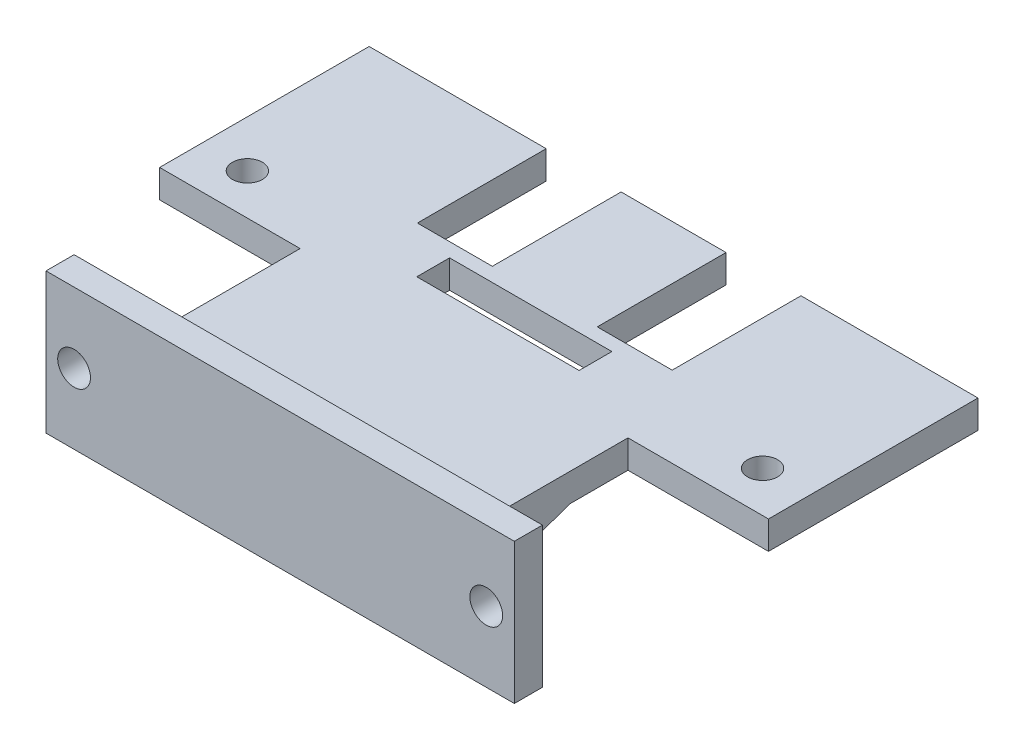
ISO-10303-21;
HEADER;
FILE_DESCRIPTION(('STEP AP214'),'2;1');
FILE_NAME('part.step','',(''),(''),'','','');
FILE_SCHEMA(('AUTOMOTIVE_DESIGN { 1 0 10303 214 1 1 1 1 }'));
ENDSEC;
DATA;
#1=APPLICATION_CONTEXT('core data for automotive mechanical design processes');
#2=APPLICATION_PROTOCOL_DEFINITION('international standard','automotive_design',2000,#1);
#3=PRODUCT_CONTEXT('',#1,'mechanical');
#4=PRODUCT('Part','Part','',(#3));
#5=PRODUCT_RELATED_PRODUCT_CATEGORY('part','',(#4));
#6=PRODUCT_DEFINITION_FORMATION('','',#4);
#7=PRODUCT_DEFINITION_CONTEXT('part definition',#1,'design');
#8=PRODUCT_DEFINITION('design','',#6,#7);
#9=PRODUCT_DEFINITION_SHAPE('','',#8);
#10=(LENGTH_UNIT() NAMED_UNIT(*) SI_UNIT(.MILLI.,.METRE.));
#11=(NAMED_UNIT(*) PLANE_ANGLE_UNIT() SI_UNIT($,.RADIAN.));
#12=(NAMED_UNIT(*) SI_UNIT($,.STERADIAN.) SOLID_ANGLE_UNIT());
#13=UNCERTAINTY_MEASURE_WITH_UNIT(LENGTH_MEASURE(1.E-05),#10,'distance_accuracy_value','');
#14=(GEOMETRIC_REPRESENTATION_CONTEXT(3) GLOBAL_UNCERTAINTY_ASSIGNED_CONTEXT((#13)) GLOBAL_UNIT_ASSIGNED_CONTEXT((#10,
#11,#12)) REPRESENTATION_CONTEXT('',''));
#15=CARTESIAN_POINT('',(0.,0.,0.));
#16=DIRECTION('',(0.,0.,1.));
#17=DIRECTION('',(1.,0.,0.));
#18=AXIS2_PLACEMENT_3D('',#15,#16,#17);
#19=CARTESIAN_POINT('',(-17.5,0.,-25.));
#20=DIRECTION('',(0.,1.,0.));
#21=DIRECTION('',(0.,0.,1.));
#22=AXIS2_PLACEMENT_3D('',#19,#20,#21);
#23=PLANE('',#22);
#24=CARTESIAN_POINT('',(27.5,0.,1.));
#25=DIRECTION('',(0.,1.,0.));
#26=DIRECTION('',(0.,0.,1.));
#27=AXIS2_PLACEMENT_3D('',#24,#25,#26);
#28=CIRCLE('',#27,1.59999999999999);
#29=CARTESIAN_POINT('',(27.5,0.,2.59999999999999));
#30=VERTEX_POINT('',#29);
#31=EDGE_CURVE('E292',#30,#30,#28,.T.);
#32=ORIENTED_EDGE('',*,*,#31,.T.);
#33=EDGE_LOOP('',(#32));
#34=FACE_BOUND('',#33,.T.);
#35=CARTESIAN_POINT('',(-27.5,0.,1.));
#36=DIRECTION('',(0.,1.,0.));
#37=DIRECTION('',(0.,0.,1.));
#38=AXIS2_PLACEMENT_3D('',#35,#36,#37);
#39=CIRCLE('',#38,1.59999999999999);
#40=CARTESIAN_POINT('',(-27.5,0.,2.59999999999999));
#41=VERTEX_POINT('',#40);
#42=EDGE_CURVE('E288',#41,#41,#39,.T.);
#43=ORIENTED_EDGE('',*,*,#42,.T.);
#44=EDGE_LOOP('',(#43));
#45=FACE_BOUND('',#44,.T.);
#46=DIRECTION('',(1.,0.,0.));
#47=VECTOR('',#46,1.);
#48=CARTESIAN_POINT('',(-17.5,0.,1.75));
#49=LINE('',#48,#47);
#50=CARTESIAN_POINT('',(-8.66365833731035,0.,1.75));
#51=VERTEX_POINT('',#50);
#52=CARTESIAN_POINT('',(8.66365833731035,0.,1.75));
#53=VERTEX_POINT('',#52);
#54=EDGE_CURVE('E42',#51,#53,#49,.T.);
#55=ORIENTED_EDGE('',*,*,#54,.T.);
#56=DIRECTION('',(0.,0.,-1.));
#57=VECTOR('',#56,1.);
#58=CARTESIAN_POINT('',(8.66365833731035,0.,-25.));
#59=LINE('',#58,#57);
#60=CARTESIAN_POINT('',(8.66365833731035,0.,-1.75));
#61=VERTEX_POINT('',#60);
#62=EDGE_CURVE('E11',#53,#61,#59,.T.);
#63=ORIENTED_EDGE('',*,*,#62,.T.);
#64=DIRECTION('',(-1.,0.,0.));
#65=VECTOR('',#64,1.);
#66=CARTESIAN_POINT('',(-17.5,0.,-1.75));
#67=LINE('',#66,#65);
#68=CARTESIAN_POINT('',(-8.66365833731035,0.,-1.75));
#69=VERTEX_POINT('',#68);
#70=EDGE_CURVE('E443',#61,#69,#67,.T.);
#71=ORIENTED_EDGE('',*,*,#70,.T.);
#72=DIRECTION('',(0.,0.,1.));
#73=VECTOR('',#72,1.);
#74=CARTESIAN_POINT('',(-8.66365833731035,0.,-25.));
#75=LINE('',#74,#73);
#76=EDGE_CURVE('E453',#69,#51,#75,.T.);
#77=ORIENTED_EDGE('',*,*,#76,.T.);
#78=EDGE_LOOP('',(#55,#63,#71,#77));
#79=FACE_BOUND('',#78,.T.);
#80=DIRECTION('',(-1.,0.,0.));
#81=VECTOR('',#80,1.);
#82=CARTESIAN_POINT('',(-12.5,0.,11.5401065880766));
#83=LINE('',#82,#81);
#84=CARTESIAN_POINT('',(-12.5,0.,11.5401065880766));
#85=VERTEX_POINT('',#84);
#86=CARTESIAN_POINT('',(-17.5,0.,11.5401065880766));
#87=VERTEX_POINT('',#86);
#88=EDGE_CURVE('E54',#85,#87,#83,.T.);
#89=ORIENTED_EDGE('',*,*,#88,.T.);
#90=DIRECTION('',(0.,0.,1.));
#91=VECTOR('',#90,1.);
#92=CARTESIAN_POINT('',(-17.5,0.,-25.));
#93=LINE('',#92,#91);
#94=CARTESIAN_POINT('',(-17.5,0.,5.36922738005254));
#95=VERTEX_POINT('',#94);
#96=EDGE_CURVE('E411',#95,#87,#93,.T.);
#97=ORIENTED_EDGE('',*,*,#96,.F.);
#98=DIRECTION('',(1.,0.,0.));
#99=VECTOR('',#98,1.);
#100=CARTESIAN_POINT('',(-32.5,0.,5.36922738005254));
#101=LINE('',#100,#99);
#102=CARTESIAN_POINT('',(-32.5,0.,5.36922738005254));
#103=VERTEX_POINT('',#102);
#104=EDGE_CURVE('E384',#103,#95,#101,.T.);
#105=ORIENTED_EDGE('',*,*,#104,.F.);
#106=DIRECTION('',(0.,0.,1.));
#107=VECTOR('',#106,1.);
#108=CARTESIAN_POINT('',(-32.5,0.,5.36922738005254));
#109=LINE('',#108,#107);
#110=CARTESIAN_POINT('',(-32.5,0.,-17.));
#111=VERTEX_POINT('',#110);
#112=EDGE_CURVE('E382',#111,#103,#109,.T.);
#113=ORIENTED_EDGE('',*,*,#112,.F.);
#114=DIRECTION('',(-1.,0.,0.));
#115=VECTOR('',#114,1.);
#116=CARTESIAN_POINT('',(-13.6,0.,-17.));
#117=LINE('',#116,#115);
#118=CARTESIAN_POINT('',(-13.6,0.,-17.));
#119=VERTEX_POINT('',#118);
#120=EDGE_CURVE('E331',#119,#111,#117,.T.);
#121=ORIENTED_EDGE('',*,*,#120,.F.);
#122=DIRECTION('',(0.,0.,-1.));
#123=VECTOR('',#122,1.);
#124=CARTESIAN_POINT('',(-13.6,0.,-3.25));
#125=LINE('',#124,#123);
#126=CARTESIAN_POINT('',(-13.6,0.,-3.25));
#127=VERTEX_POINT('',#126);
#128=EDGE_CURVE('E328',#127,#119,#125,.T.);
#129=ORIENTED_EDGE('',*,*,#128,.F.);
#130=DIRECTION('',(-1.,0.,0.));
#131=VECTOR('',#130,1.);
#132=CARTESIAN_POINT('',(-5.6,0.,-3.25));
#133=LINE('',#132,#131);
#134=CARTESIAN_POINT('',(-5.6,0.,-3.25));
#135=VERTEX_POINT('',#134);
#136=EDGE_CURVE('E325',#135,#127,#133,.T.);
#137=ORIENTED_EDGE('',*,*,#136,.F.);
#138=DIRECTION('',(0.,0.,1.));
#139=VECTOR('',#138,1.);
#140=CARTESIAN_POINT('',(-5.6,0.,-17.));
#141=LINE('',#140,#139);
#142=CARTESIAN_POINT('',(-5.6,0.,-17.));
#143=VERTEX_POINT('',#142);
#144=EDGE_CURVE('E322',#143,#135,#141,.T.);
#145=ORIENTED_EDGE('',*,*,#144,.F.);
#146=DIRECTION('',(-1.,0.,0.));
#147=VECTOR('',#146,1.);
#148=CARTESIAN_POINT('',(5.6,0.,-17.));
#149=LINE('',#148,#147);
#150=CARTESIAN_POINT('',(5.6,0.,-17.));
#151=VERTEX_POINT('',#150);
#152=EDGE_CURVE('E319',#151,#143,#149,.T.);
#153=ORIENTED_EDGE('',*,*,#152,.F.);
#154=DIRECTION('',(0.,0.,-1.));
#155=VECTOR('',#154,1.);
#156=CARTESIAN_POINT('',(5.6,0.,-3.25));
#157=LINE('',#156,#155);
#158=CARTESIAN_POINT('',(5.6,0.,-3.25));
#159=VERTEX_POINT('',#158);
#160=EDGE_CURVE('E316',#159,#151,#157,.T.);
#161=ORIENTED_EDGE('',*,*,#160,.F.);
#162=DIRECTION('',(-1.,0.,0.));
#163=VECTOR('',#162,1.);
#164=CARTESIAN_POINT('',(13.6,0.,-3.25));
#165=LINE('',#164,#163);
#166=CARTESIAN_POINT('',(13.6,0.,-3.25));
#167=VERTEX_POINT('',#166);
#168=EDGE_CURVE('E313',#167,#159,#165,.T.);
#169=ORIENTED_EDGE('',*,*,#168,.F.);
#170=DIRECTION('',(0.,0.,1.));
#171=VECTOR('',#170,1.);
#172=CARTESIAN_POINT('',(13.6,0.,-17.));
#173=LINE('',#172,#171);
#174=CARTESIAN_POINT('',(13.6,0.,-17.));
#175=VERTEX_POINT('',#174);
#176=EDGE_CURVE('E310',#175,#167,#173,.T.);
#177=ORIENTED_EDGE('',*,*,#176,.F.);
#178=DIRECTION('',(-1.,0.,0.));
#179=VECTOR('',#178,1.);
#180=CARTESIAN_POINT('',(17.5,0.,-17.));
#181=LINE('',#180,#179);
#182=CARTESIAN_POINT('',(32.5,0.,-17.));
#183=VERTEX_POINT('',#182);
#184=EDGE_CURVE('E307',#183,#175,#181,.T.);
#185=ORIENTED_EDGE('',*,*,#184,.F.);
#186=DIRECTION('',(0.,0.,-1.));
#187=VECTOR('',#186,1.);
#188=CARTESIAN_POINT('',(32.5,0.,-25.));
#189=LINE('',#188,#187);
#190=CARTESIAN_POINT('',(32.5,0.,5.36922738005253));
#191=VERTEX_POINT('',#190);
#192=EDGE_CURVE('E395',#191,#183,#189,.T.);
#193=ORIENTED_EDGE('',*,*,#192,.F.);
#194=DIRECTION('',(-1.,0.,0.));
#195=VECTOR('',#194,1.);
#196=CARTESIAN_POINT('',(32.5,0.,5.36922738005253));
#197=LINE('',#196,#195);
#198=CARTESIAN_POINT('',(17.5,0.,5.36922738005253));
#199=VERTEX_POINT('',#198);
#200=EDGE_CURVE('E398',#191,#199,#197,.T.);
#201=ORIENTED_EDGE('',*,*,#200,.T.);
#202=DIRECTION('',(0.,0.,1.));
#203=VECTOR('',#202,1.);
#204=CARTESIAN_POINT('',(17.5,0.,-25.));
#205=LINE('',#204,#203);
#206=CARTESIAN_POINT('',(17.5,0.,11.5401065880766));
#207=VERTEX_POINT('',#206);
#208=EDGE_CURVE('E413',#199,#207,#205,.T.);
#209=ORIENTED_EDGE('',*,*,#208,.T.);
#210=DIRECTION('',(1.,0.,0.));
#211=VECTOR('',#210,1.);
#212=CARTESIAN_POINT('',(12.5,0.,11.5401065880766));
#213=LINE('',#212,#211);
#214=CARTESIAN_POINT('',(12.5,0.,11.5401065880766));
#215=VERTEX_POINT('',#214);
#216=EDGE_CURVE('E244',#215,#207,#213,.T.);
#217=ORIENTED_EDGE('',*,*,#216,.F.);
#218=DIRECTION('',(0.,0.,1.));
#219=VECTOR('',#218,1.);
#220=CARTESIAN_POINT('',(12.5,0.,22.));
#221=LINE('',#220,#219);
#222=CARTESIAN_POINT('',(12.5,0.,22.));
#223=VERTEX_POINT('',#222);
#224=EDGE_CURVE('E245',#215,#223,#221,.T.);
#225=ORIENTED_EDGE('',*,*,#224,.T.);
#226=DIRECTION('',(-1.,0.,0.));
#227=VECTOR('',#226,1.);
#228=CARTESIAN_POINT('',(-17.5,0.,22.));
#229=LINE('',#228,#227);
#230=CARTESIAN_POINT('',(-12.5,0.,22.));
#231=VERTEX_POINT('',#230);
#232=EDGE_CURVE('E232',#223,#231,#229,.T.);
#233=ORIENTED_EDGE('',*,*,#232,.T.);
#234=DIRECTION('',(0.,0.,1.));
#235=VECTOR('',#234,1.);
#236=CARTESIAN_POINT('',(-12.5,0.,22.));
#237=LINE('',#236,#235);
#238=EDGE_CURVE('E49',#85,#231,#237,.T.);
#239=ORIENTED_EDGE('',*,*,#238,.F.);
#240=EDGE_LOOP('',(#89,#97,#105,#113,#121,#129,#137,#145,#153,#161,#169,#177,#185,#193,#201,
#209,#217,#225,#233,#239));
#241=FACE_BOUND('',#240,.T.);
#242=ADVANCED_FACE('F34',(#34,#45,#79,#241),#23,.F.);
#243=CARTESIAN_POINT('',(17.5,3.,-25.));
#244=DIRECTION('',(0.,-1.,0.));
#245=DIRECTION('',(0.,0.,-1.));
#246=AXIS2_PLACEMENT_3D('',#243,#244,#245);
#247=PLANE('',#246);
#248=DIRECTION('',(-1.,0.,0.));
#249=VECTOR('',#248,1.);
#250=CARTESIAN_POINT('',(-8.66365833731035,3.,-1.75));
#251=LINE('',#250,#249);
#252=CARTESIAN_POINT('',(8.66365833731035,3.,-1.75));
#253=VERTEX_POINT('',#252);
#254=CARTESIAN_POINT('',(-8.66365833731035,3.,-1.75));
#255=VERTEX_POINT('',#254);
#256=EDGE_CURVE('E261',#253,#255,#251,.T.);
#257=ORIENTED_EDGE('',*,*,#256,.F.);
#258=DIRECTION('',(0.,0.,-1.));
#259=VECTOR('',#258,1.);
#260=CARTESIAN_POINT('',(8.66365833731035,3.,-1.75));
#261=LINE('',#260,#259);
#262=CARTESIAN_POINT('',(8.66365833731035,3.,1.75));
#263=VERTEX_POINT('',#262);
#264=EDGE_CURVE('E258',#263,#253,#261,.T.);
#265=ORIENTED_EDGE('',*,*,#264,.F.);
#266=DIRECTION('',(1.,0.,0.));
#267=VECTOR('',#266,1.);
#268=CARTESIAN_POINT('',(-8.66365833731035,3.,1.75));
#269=LINE('',#268,#267);
#270=CARTESIAN_POINT('',(-8.66365833731035,3.,1.75));
#271=VERTEX_POINT('',#270);
#272=EDGE_CURVE('E267',#271,#263,#269,.T.);
#273=ORIENTED_EDGE('',*,*,#272,.F.);
#274=DIRECTION('',(0.,0.,1.));
#275=VECTOR('',#274,1.);
#276=CARTESIAN_POINT('',(-8.66365833731035,3.,-1.75));
#277=LINE('',#276,#275);
#278=EDGE_CURVE('E264',#255,#271,#277,.T.);
#279=ORIENTED_EDGE('',*,*,#278,.F.);
#280=EDGE_LOOP('',(#257,#265,#273,#279));
#281=FACE_BOUND('',#280,.T.);
#282=CARTESIAN_POINT('',(-27.5,3.,1.));
#283=DIRECTION('',(0.,1.,0.));
#284=DIRECTION('',(0.,0.,1.));
#285=AXIS2_PLACEMENT_3D('',#282,#283,#284);
#286=CIRCLE('',#285,1.59999999999999);
#287=CARTESIAN_POINT('',(-27.5,3.,2.59999999999999));
#288=VERTEX_POINT('',#287);
#289=EDGE_CURVE('E283',#288,#288,#286,.T.);
#290=ORIENTED_EDGE('',*,*,#289,.F.);
#291=EDGE_LOOP('',(#290));
#292=FACE_BOUND('',#291,.T.);
#293=CARTESIAN_POINT('',(27.5,3.,1.));
#294=DIRECTION('',(0.,1.,0.));
#295=DIRECTION('',(0.,0.,1.));
#296=AXIS2_PLACEMENT_3D('',#293,#294,#295);
#297=CIRCLE('',#296,1.59999999999999);
#298=CARTESIAN_POINT('',(27.5,3.,2.59999999999999));
#299=VERTEX_POINT('',#298);
#300=EDGE_CURVE('E289',#299,#299,#297,.T.);
#301=ORIENTED_EDGE('',*,*,#300,.F.);
#302=EDGE_LOOP('',(#301));
#303=FACE_BOUND('',#302,.T.);
#304=DIRECTION('',(-1.,0.,0.));
#305=VECTOR('',#304,1.);
#306=CARTESIAN_POINT('',(17.5,3.,-17.));
#307=LINE('',#306,#305);
#308=CARTESIAN_POINT('',(-13.6,3.,-17.));
#309=VERTEX_POINT('',#308);
#310=CARTESIAN_POINT('',(-32.5,3.,-17.));
#311=VERTEX_POINT('',#310);
#312=EDGE_CURVE('E373',#309,#311,#307,.T.);
#313=ORIENTED_EDGE('',*,*,#312,.T.);
#314=DIRECTION('',(0.,0.,-1.));
#315=VECTOR('',#314,1.);
#316=CARTESIAN_POINT('',(-32.5,3.,-25.));
#317=LINE('',#316,#315);
#318=CARTESIAN_POINT('',(-32.5,3.,5.36922738005254));
#319=VERTEX_POINT('',#318);
#320=EDGE_CURVE('E379',#319,#311,#317,.T.);
#321=ORIENTED_EDGE('',*,*,#320,.F.);
#322=DIRECTION('',(1.,0.,0.));
#323=VECTOR('',#322,1.);
#324=CARTESIAN_POINT('',(-32.5,3.,5.36922738005254));
#325=LINE('',#324,#323);
#326=CARTESIAN_POINT('',(-17.5,3.,5.36922738005254));
#327=VERTEX_POINT('',#326);
#328=EDGE_CURVE('E388',#319,#327,#325,.T.);
#329=ORIENTED_EDGE('',*,*,#328,.T.);
#330=DIRECTION('',(0.,0.,1.));
#331=VECTOR('',#330,1.);
#332=CARTESIAN_POINT('',(-17.5,3.,-25.));
#333=LINE('',#332,#331);
#334=CARTESIAN_POINT('',(-17.5,3.,22.));
#335=VERTEX_POINT('',#334);
#336=EDGE_CURVE('E409',#327,#335,#333,.T.);
#337=ORIENTED_EDGE('',*,*,#336,.T.);
#338=DIRECTION('',(1.,0.,0.));
#339=VECTOR('',#338,1.);
#340=CARTESIAN_POINT('',(17.5,3.,22.));
#341=LINE('',#340,#339);
#342=CARTESIAN_POINT('',(17.5,3.,22.));
#343=VERTEX_POINT('',#342);
#344=EDGE_CURVE('E233',#335,#343,#341,.T.);
#345=ORIENTED_EDGE('',*,*,#344,.T.);
#346=DIRECTION('',(0.,0.,1.));
#347=VECTOR('',#346,1.);
#348=CARTESIAN_POINT('',(17.5,3.,-25.));
#349=LINE('',#348,#347);
#350=CARTESIAN_POINT('',(17.5,3.,5.36922738005253));
#351=VERTEX_POINT('',#350);
#352=EDGE_CURVE('E228',#351,#343,#349,.T.);
#353=ORIENTED_EDGE('',*,*,#352,.F.);
#354=DIRECTION('',(-1.,0.,0.));
#355=VECTOR('',#354,1.);
#356=CARTESIAN_POINT('',(32.5,3.,5.36922738005253));
#357=LINE('',#356,#355);
#358=CARTESIAN_POINT('',(32.5,3.,5.36922738005253));
#359=VERTEX_POINT('',#358);
#360=EDGE_CURVE('E402',#359,#351,#357,.T.);
#361=ORIENTED_EDGE('',*,*,#360,.F.);
#362=DIRECTION('',(0.,0.,1.));
#363=VECTOR('',#362,1.);
#364=CARTESIAN_POINT('',(32.5,3.,5.36922738005253));
#365=LINE('',#364,#363);
#366=CARTESIAN_POINT('',(32.5,3.,-17.));
#367=VERTEX_POINT('',#366);
#368=EDGE_CURVE('E391',#367,#359,#365,.T.);
#369=ORIENTED_EDGE('',*,*,#368,.F.);
#370=DIRECTION('',(-1.,0.,0.));
#371=VECTOR('',#370,1.);
#372=CARTESIAN_POINT('',(17.5,3.,-17.));
#373=LINE('',#372,#371);
#374=CARTESIAN_POINT('',(13.6,3.,-17.));
#375=VERTEX_POINT('',#374);
#376=EDGE_CURVE('E336',#367,#375,#373,.T.);
#377=ORIENTED_EDGE('',*,*,#376,.T.);
#378=DIRECTION('',(0.,0.,1.));
#379=VECTOR('',#378,1.);
#380=CARTESIAN_POINT('',(13.6,3.,-25.));
#381=LINE('',#380,#379);
#382=CARTESIAN_POINT('',(13.6,3.,-3.25));
#383=VERTEX_POINT('',#382);
#384=EDGE_CURVE('E352',#375,#383,#381,.T.);
#385=ORIENTED_EDGE('',*,*,#384,.T.);
#386=DIRECTION('',(-1.,0.,0.));
#387=VECTOR('',#386,1.);
#388=CARTESIAN_POINT('',(17.5,3.,-3.25));
#389=LINE('',#388,#387);
#390=CARTESIAN_POINT('',(5.6,3.,-3.25));
#391=VERTEX_POINT('',#390);
#392=EDGE_CURVE('E355',#383,#391,#389,.T.);
#393=ORIENTED_EDGE('',*,*,#392,.T.);
#394=DIRECTION('',(0.,0.,-1.));
#395=VECTOR('',#394,1.);
#396=CARTESIAN_POINT('',(5.6,3.,-25.));
#397=LINE('',#396,#395);
#398=CARTESIAN_POINT('',(5.6,3.,-17.));
#399=VERTEX_POINT('',#398);
#400=EDGE_CURVE('E358',#391,#399,#397,.T.);
#401=ORIENTED_EDGE('',*,*,#400,.T.);
#402=DIRECTION('',(-1.,0.,0.));
#403=VECTOR('',#402,1.);
#404=CARTESIAN_POINT('',(17.5,3.,-17.));
#405=LINE('',#404,#403);
#406=CARTESIAN_POINT('',(-5.6,3.,-17.));
#407=VERTEX_POINT('',#406);
#408=EDGE_CURVE('E361',#399,#407,#405,.T.);
#409=ORIENTED_EDGE('',*,*,#408,.T.);
#410=DIRECTION('',(0.,0.,1.));
#411=VECTOR('',#410,1.);
#412=CARTESIAN_POINT('',(-5.6,3.,-25.));
#413=LINE('',#412,#411);
#414=CARTESIAN_POINT('',(-5.6,3.,-3.25));
#415=VERTEX_POINT('',#414);
#416=EDGE_CURVE('E364',#407,#415,#413,.T.);
#417=ORIENTED_EDGE('',*,*,#416,.T.);
#418=DIRECTION('',(-1.,0.,0.));
#419=VECTOR('',#418,1.);
#420=CARTESIAN_POINT('',(17.5,3.,-3.25));
#421=LINE('',#420,#419);
#422=CARTESIAN_POINT('',(-13.6,3.,-3.25));
#423=VERTEX_POINT('',#422);
#424=EDGE_CURVE('E367',#415,#423,#421,.T.);
#425=ORIENTED_EDGE('',*,*,#424,.T.);
#426=DIRECTION('',(0.,0.,-1.));
#427=VECTOR('',#426,1.);
#428=CARTESIAN_POINT('',(-13.6,3.,-25.));
#429=LINE('',#428,#427);
#430=EDGE_CURVE('E370',#423,#309,#429,.T.);
#431=ORIENTED_EDGE('',*,*,#430,.T.);
#432=EDGE_LOOP('',(#313,#321,#329,#337,#345,#353,#361,#369,#377,#385,#393,#401,#409,#417,#425,#431));
#433=FACE_BOUND('',#432,.T.);
#434=ADVANCED_FACE('F469',(#281,#292,#303,#433),#247,.F.);
#435=CARTESIAN_POINT('',(32.5,0.,0.));
#436=DIRECTION('',(-1.,0.,0.));
#437=DIRECTION('',(0.,0.,1.));
#438=AXIS2_PLACEMENT_3D('',#435,#436,#437);
#439=PLANE('',#438);
#440=DIRECTION('',(0.,-1.,0.));
#441=VECTOR('',#440,1.);
#442=CARTESIAN_POINT('',(32.5,0.,-17.));
#443=LINE('',#442,#441);
#444=EDGE_CURVE('E280',#367,#183,#443,.T.);
#445=ORIENTED_EDGE('',*,*,#444,.F.);
#446=ORIENTED_EDGE('',*,*,#368,.T.);
#447=DIRECTION('',(0.,-1.,0.));
#448=VECTOR('',#447,1.);
#449=CARTESIAN_POINT('',(32.5,0.,5.36922738005253));
#450=LINE('',#449,#448);
#451=EDGE_CURVE('E393',#359,#191,#450,.T.);
#452=ORIENTED_EDGE('',*,*,#451,.T.);
#453=ORIENTED_EDGE('',*,*,#192,.T.);
#454=EDGE_LOOP('',(#445,#446,#452,#453));
#455=FACE_BOUND('',#454,.T.);
#456=ADVANCED_FACE('F492',(#455),#439,.F.);
#457=CARTESIAN_POINT('',(-32.5,0.,0.));
#458=DIRECTION('',(1.,0.,0.));
#459=DIRECTION('',(0.,0.,-1.));
#460=AXIS2_PLACEMENT_3D('',#457,#458,#459);
#461=PLANE('',#460);
#462=DIRECTION('',(0.,-1.,0.));
#463=VECTOR('',#462,1.);
#464=CARTESIAN_POINT('',(-32.5,0.,-17.));
#465=LINE('',#464,#463);
#466=EDGE_CURVE('E273',#311,#111,#465,.T.);
#467=ORIENTED_EDGE('',*,*,#466,.T.);
#468=ORIENTED_EDGE('',*,*,#112,.T.);
#469=DIRECTION('',(0.,1.,0.));
#470=VECTOR('',#469,1.);
#471=CARTESIAN_POINT('',(-32.5,3.,5.36922738005254));
#472=LINE('',#471,#470);
#473=EDGE_CURVE('E376',#103,#319,#472,.T.);
#474=ORIENTED_EDGE('',*,*,#473,.T.);
#475=ORIENTED_EDGE('',*,*,#320,.T.);
#476=EDGE_LOOP('',(#467,#468,#474,#475));
#477=FACE_BOUND('',#476,.T.);
#478=ADVANCED_FACE('F703',(#477),#461,.F.);
#479=CARTESIAN_POINT('',(-17.5,3.,-25.));
#480=DIRECTION('',(1.,0.,0.));
#481=DIRECTION('',(0.,0.,-1.));
#482=AXIS2_PLACEMENT_3D('',#479,#480,#481);
#483=PLANE('',#482);
#484=DIRECTION('',(0.,1.,0.));
#485=VECTOR('',#484,1.);
#486=CARTESIAN_POINT('',(-17.5,3.,5.36922738005254));
#487=LINE('',#486,#485);
#488=EDGE_CURVE('E375',#95,#327,#487,.T.);
#489=ORIENTED_EDGE('',*,*,#488,.F.);
#490=ORIENTED_EDGE('',*,*,#96,.T.);
#491=DIRECTION('',(0.,0.329947645064478,-0.943999232794394));
#492=VECTOR('',#491,1.);
#493=CARTESIAN_POINT('',(-17.5,-3.65595339381093,22.));
#494=LINE('',#493,#492);
#495=CARTESIAN_POINT('',(-17.5,-3.65595339381093,22.));
#496=VERTEX_POINT('',#495);
#497=EDGE_CURVE('E826',#496,#87,#494,.T.);
#498=ORIENTED_EDGE('',*,*,#497,.F.);
#499=DIRECTION('',(0.,1.,0.));
#500=VECTOR('',#499,1.);
#501=CARTESIAN_POINT('',(-17.5,3.,22.));
#502=LINE('',#501,#500);
#503=EDGE_CURVE('E406',#496,#335,#502,.T.);
#504=ORIENTED_EDGE('',*,*,#503,.T.);
#505=ORIENTED_EDGE('',*,*,#336,.F.);
#506=EDGE_LOOP('',(#489,#490,#498,#504,#505));
#507=FACE_BOUND('',#506,.T.);
#508=ADVANCED_FACE('F497',(#507),#483,.F.);
#509=CARTESIAN_POINT('',(17.5,0.,-25.));
#510=DIRECTION('',(-1.,0.,0.));
#511=DIRECTION('',(0.,0.,1.));
#512=AXIS2_PLACEMENT_3D('',#509,#510,#511);
#513=PLANE('',#512);
#514=DIRECTION('',(0.,-1.,0.));
#515=VECTOR('',#514,1.);
#516=CARTESIAN_POINT('',(17.5,0.,5.36922738005253));
#517=LINE('',#516,#515);
#518=EDGE_CURVE('E390',#351,#199,#517,.T.);
#519=ORIENTED_EDGE('',*,*,#518,.F.);
#520=ORIENTED_EDGE('',*,*,#352,.T.);
#521=DIRECTION('',(0.,-1.,0.));
#522=VECTOR('',#521,1.);
#523=CARTESIAN_POINT('',(17.5,0.,22.));
#524=LINE('',#523,#522);
#525=CARTESIAN_POINT('',(17.5,-3.65595339381093,22.));
#526=VERTEX_POINT('',#525);
#527=EDGE_CURVE('E220',#343,#526,#524,.T.);
#528=ORIENTED_EDGE('',*,*,#527,.T.);
#529=DIRECTION('',(0.,0.329947645064478,-0.943999232794394));
#530=VECTOR('',#529,1.);
#531=CARTESIAN_POINT('',(17.5,-3.65595339381093,22.));
#532=LINE('',#531,#530);
#533=EDGE_CURVE('E226',#526,#207,#532,.T.);
#534=ORIENTED_EDGE('',*,*,#533,.T.);
#535=ORIENTED_EDGE('',*,*,#208,.F.);
#536=EDGE_LOOP('',(#519,#520,#528,#534,#535));
#537=FACE_BOUND('',#536,.T.);
#538=ADVANCED_FACE('F223',(#537),#513,.F.);
#539=CARTESIAN_POINT('',(0.,0.,22.));
#540=DIRECTION('',(0.,0.,1.));
#541=DIRECTION('',(1.,0.,0.));
#542=AXIS2_PLACEMENT_3D('',#539,#540,#541);
#543=PLANE('',#542);
#544=CARTESIAN_POINT('',(22.,-0.5,22.));
#545=DIRECTION('',(0.,0.,1.));
#546=DIRECTION('',(1.,0.,0.));
#547=AXIS2_PLACEMENT_3D('',#544,#545,#546);
#548=CIRCLE('',#547,1.75);
#549=CARTESIAN_POINT('',(23.75,-0.5,22.));
#550=VERTEX_POINT('',#549);
#551=EDGE_CURVE('E298',#550,#550,#548,.T.);
#552=ORIENTED_EDGE('',*,*,#551,.T.);
#553=EDGE_LOOP('',(#552));
#554=FACE_BOUND('',#553,.T.);
#555=CARTESIAN_POINT('',(-22.,-0.5,22.));
#556=DIRECTION('',(0.,0.,1.));
#557=DIRECTION('',(1.,0.,0.));
#558=AXIS2_PLACEMENT_3D('',#555,#556,#557);
#559=CIRCLE('',#558,1.75);
#560=CARTESIAN_POINT('',(-20.25,-0.5,22.));
#561=VERTEX_POINT('',#560);
#562=EDGE_CURVE('E304',#561,#561,#559,.T.);
#563=ORIENTED_EDGE('',*,*,#562,.T.);
#564=EDGE_LOOP('',(#563));
#565=FACE_BOUND('',#564,.T.);
#566=DIRECTION('',(0.,1.,0.));
#567=VECTOR('',#566,1.);
#568=CARTESIAN_POINT('',(25.,-8.,22.));
#569=LINE('',#568,#567);
#570=CARTESIAN_POINT('',(25.,-8.,22.));
#571=VERTEX_POINT('',#570);
#572=CARTESIAN_POINT('',(25.,7.,22.));
#573=VERTEX_POINT('',#572);
#574=EDGE_CURVE('E417',#571,#573,#569,.T.);
#575=ORIENTED_EDGE('',*,*,#574,.F.);
#576=DIRECTION('',(1.,0.,0.));
#577=VECTOR('',#576,1.);
#578=CARTESIAN_POINT('',(-25.,-8.,22.));
#579=LINE('',#578,#577);
#580=CARTESIAN_POINT('',(-25.,-8.,22.));
#581=VERTEX_POINT('',#580);
#582=EDGE_CURVE('E427',#581,#571,#579,.T.);
#583=ORIENTED_EDGE('',*,*,#582,.F.);
#584=DIRECTION('',(0.,-1.,0.));
#585=VECTOR('',#584,1.);
#586=CARTESIAN_POINT('',(-25.,7.,22.));
#587=LINE('',#586,#585);
#588=CARTESIAN_POINT('',(-25.,7.,22.));
#589=VERTEX_POINT('',#588);
#590=EDGE_CURVE('E424',#589,#581,#587,.T.);
#591=ORIENTED_EDGE('',*,*,#590,.F.);
#592=DIRECTION('',(-1.,0.,0.));
#593=VECTOR('',#592,1.);
#594=CARTESIAN_POINT('',(25.,7.,22.));
#595=LINE('',#594,#593);
#596=EDGE_CURVE('E420',#573,#589,#595,.T.);
#597=ORIENTED_EDGE('',*,*,#596,.F.);
#598=EDGE_LOOP('',(#575,#583,#591,#597));
#599=FACE_BOUND('',#598,.T.);
#600=DIRECTION('',(-1.,0.,0.));
#601=VECTOR('',#600,1.);
#602=CARTESIAN_POINT('',(-12.5,-3.65595339381093,22.));
#603=LINE('',#602,#601);
#604=CARTESIAN_POINT('',(-12.5,-3.65595339381093,22.));
#605=VERTEX_POINT('',#604);
#606=EDGE_CURVE('E249',#605,#496,#603,.T.);
#607=ORIENTED_EDGE('',*,*,#606,.F.);
#608=DIRECTION('',(0.,-1.,0.));
#609=VECTOR('',#608,1.);
#610=CARTESIAN_POINT('',(-12.5,-3.65595339381093,22.));
#611=LINE('',#610,#609);
#612=EDGE_CURVE('E823',#231,#605,#611,.T.);
#613=ORIENTED_EDGE('',*,*,#612,.F.);
#614=ORIENTED_EDGE('',*,*,#232,.F.);
#615=DIRECTION('',(0.,-1.,0.));
#616=VECTOR('',#615,1.);
#617=CARTESIAN_POINT('',(12.5,-3.65595339381093,22.));
#618=LINE('',#617,#616);
#619=CARTESIAN_POINT('',(12.5,-3.65595339381093,22.));
#620=VERTEX_POINT('',#619);
#621=EDGE_CURVE('E240',#223,#620,#618,.T.);
#622=ORIENTED_EDGE('',*,*,#621,.T.);
#623=DIRECTION('',(1.,0.,0.));
#624=VECTOR('',#623,1.);
#625=CARTESIAN_POINT('',(12.5,-3.65595339381093,22.));
#626=LINE('',#625,#624);
#627=EDGE_CURVE('E236',#620,#526,#626,.T.);
#628=ORIENTED_EDGE('',*,*,#627,.T.);
#629=ORIENTED_EDGE('',*,*,#527,.F.);
#630=ORIENTED_EDGE('',*,*,#344,.F.);
#631=ORIENTED_EDGE('',*,*,#503,.F.);
#632=EDGE_LOOP('',(#607,#613,#614,#622,#628,#629,#630,#631));
#633=FACE_BOUND('',#632,.T.);
#634=ADVANCED_FACE('F237',(#554,#565,#599,#633),#543,.F.);
#635=CARTESIAN_POINT('',(25.,-8.,22.));
#636=DIRECTION('',(1.,0.,0.));
#637=DIRECTION('',(0.,0.,-1.));
#638=AXIS2_PLACEMENT_3D('',#635,#636,#637);
#639=PLANE('',#638);
#640=DIRECTION('',(0.,1.,0.));
#641=VECTOR('',#640,1.);
#642=CARTESIAN_POINT('',(25.,-8.,25.));
#643=LINE('',#642,#641);
#644=CARTESIAN_POINT('',(25.,-8.,25.));
#645=VERTEX_POINT('',#644);
#646=CARTESIAN_POINT('',(25.,7.,25.));
#647=VERTEX_POINT('',#646);
#648=EDGE_CURVE('E416',#645,#647,#643,.T.);
#649=ORIENTED_EDGE('',*,*,#648,.F.);
#650=DIRECTION('',(0.,0.,1.));
#651=VECTOR('',#650,1.);
#652=CARTESIAN_POINT('',(25.,-8.,22.));
#653=LINE('',#652,#651);
#654=EDGE_CURVE('E441',#571,#645,#653,.T.);
#655=ORIENTED_EDGE('',*,*,#654,.F.);
#656=ORIENTED_EDGE('',*,*,#574,.T.);
#657=DIRECTION('',(0.,0.,1.));
#658=VECTOR('',#657,1.);
#659=CARTESIAN_POINT('',(25.,7.,22.));
#660=LINE('',#659,#658);
#661=EDGE_CURVE('E430',#573,#647,#660,.T.);
#662=ORIENTED_EDGE('',*,*,#661,.T.);
#663=EDGE_LOOP('',(#649,#655,#656,#662));
#664=FACE_BOUND('',#663,.T.);
#665=ADVANCED_FACE('F36',(#664),#639,.T.);
#666=CARTESIAN_POINT('',(-25.,-8.,22.));
#667=DIRECTION('',(0.,-1.,0.));
#668=DIRECTION('',(0.,0.,-1.));
#669=AXIS2_PLACEMENT_3D('',#666,#667,#668);
#670=PLANE('',#669);
#671=DIRECTION('',(1.,0.,0.));
#672=VECTOR('',#671,1.);
#673=CARTESIAN_POINT('',(-25.,-8.,25.));
#674=LINE('',#673,#672);
#675=CARTESIAN_POINT('',(-25.,-8.,25.));
#676=VERTEX_POINT('',#675);
#677=EDGE_CURVE('E421',#676,#645,#674,.T.);
#678=ORIENTED_EDGE('',*,*,#677,.F.);
#679=DIRECTION('',(0.,0.,1.));
#680=VECTOR('',#679,1.);
#681=CARTESIAN_POINT('',(-25.,-8.,22.));
#682=LINE('',#681,#680);
#683=EDGE_CURVE('E444',#581,#676,#682,.T.);
#684=ORIENTED_EDGE('',*,*,#683,.F.);
#685=ORIENTED_EDGE('',*,*,#582,.T.);
#686=ORIENTED_EDGE('',*,*,#654,.T.);
#687=EDGE_LOOP('',(#678,#684,#685,#686));
#688=FACE_BOUND('',#687,.T.);
#689=ADVANCED_FACE('F510',(#688),#670,.T.);
#690=CARTESIAN_POINT('',(-25.,7.,22.));
#691=DIRECTION('',(-1.,0.,0.));
#692=DIRECTION('',(0.,0.,1.));
#693=AXIS2_PLACEMENT_3D('',#690,#691,#692);
#694=PLANE('',#693);
#695=DIRECTION('',(0.,-1.,0.));
#696=VECTOR('',#695,1.);
#697=CARTESIAN_POINT('',(-25.,7.,25.));
#698=LINE('',#697,#696);
#699=CARTESIAN_POINT('',(-25.,7.,25.));
#700=VERTEX_POINT('',#699);
#701=EDGE_CURVE('E436',#700,#676,#698,.T.);
#702=ORIENTED_EDGE('',*,*,#701,.F.);
#703=DIRECTION('',(0.,0.,1.));
#704=VECTOR('',#703,1.);
#705=CARTESIAN_POINT('',(-25.,7.,22.));
#706=LINE('',#705,#704);
#707=EDGE_CURVE('E446',#589,#700,#706,.T.);
#708=ORIENTED_EDGE('',*,*,#707,.F.);
#709=ORIENTED_EDGE('',*,*,#590,.T.);
#710=ORIENTED_EDGE('',*,*,#683,.T.);
#711=EDGE_LOOP('',(#702,#708,#709,#710));
#712=FACE_BOUND('',#711,.T.);
#713=ADVANCED_FACE('F513',(#712),#694,.T.);
#714=CARTESIAN_POINT('',(25.,7.,22.));
#715=DIRECTION('',(0.,1.,0.));
#716=DIRECTION('',(0.,0.,1.));
#717=AXIS2_PLACEMENT_3D('',#714,#715,#716);
#718=PLANE('',#717);
#719=DIRECTION('',(-1.,0.,0.));
#720=VECTOR('',#719,1.);
#721=CARTESIAN_POINT('',(25.,7.,25.));
#722=LINE('',#721,#720);
#723=EDGE_CURVE('E433',#647,#700,#722,.T.);
#724=ORIENTED_EDGE('',*,*,#723,.F.);
#725=ORIENTED_EDGE('',*,*,#661,.F.);
#726=ORIENTED_EDGE('',*,*,#596,.T.);
#727=ORIENTED_EDGE('',*,*,#707,.T.);
#728=EDGE_LOOP('',(#724,#725,#726,#727));
#729=FACE_BOUND('',#728,.T.);
#730=ADVANCED_FACE('F508',(#729),#718,.T.);
#731=CARTESIAN_POINT('',(0.,0.,25.));
#732=DIRECTION('',(0.,0.,1.));
#733=DIRECTION('',(1.,0.,0.));
#734=AXIS2_PLACEMENT_3D('',#731,#732,#733);
#735=PLANE('',#734);
#736=CARTESIAN_POINT('',(22.,-0.5,25.));
#737=DIRECTION('',(0.,0.,1.));
#738=DIRECTION('',(1.,0.,0.));
#739=AXIS2_PLACEMENT_3D('',#736,#737,#738);
#740=CIRCLE('',#739,1.75);
#741=CARTESIAN_POINT('',(23.75,-0.5,25.));
#742=VERTEX_POINT('',#741);
#743=EDGE_CURVE('E295',#742,#742,#740,.T.);
#744=ORIENTED_EDGE('',*,*,#743,.F.);
#745=EDGE_LOOP('',(#744));
#746=FACE_BOUND('',#745,.T.);
#747=CARTESIAN_POINT('',(-22.,-0.5,25.));
#748=DIRECTION('',(0.,0.,1.));
#749=DIRECTION('',(1.,0.,0.));
#750=AXIS2_PLACEMENT_3D('',#747,#748,#749);
#751=CIRCLE('',#750,1.75);
#752=CARTESIAN_POINT('',(-20.25,-0.5,25.));
#753=VERTEX_POINT('',#752);
#754=EDGE_CURVE('E301',#753,#753,#751,.T.);
#755=ORIENTED_EDGE('',*,*,#754,.F.);
#756=EDGE_LOOP('',(#755));
#757=FACE_BOUND('',#756,.T.);
#758=ORIENTED_EDGE('',*,*,#648,.T.);
#759=ORIENTED_EDGE('',*,*,#723,.T.);
#760=ORIENTED_EDGE('',*,*,#701,.T.);
#761=ORIENTED_EDGE('',*,*,#677,.T.);
#762=EDGE_LOOP('',(#758,#759,#760,#761));
#763=FACE_BOUND('',#762,.T.);
#764=ADVANCED_FACE('F504',(#746,#757,#763),#735,.T.);
#765=CARTESIAN_POINT('',(32.5,0.,5.36922738005253));
#766=DIRECTION('',(0.,0.,-1.));
#767=DIRECTION('',(-1.,0.,0.));
#768=AXIS2_PLACEMENT_3D('',#765,#766,#767);
#769=PLANE('',#768);
#770=ORIENTED_EDGE('',*,*,#518,.T.);
#771=ORIENTED_EDGE('',*,*,#200,.F.);
#772=ORIENTED_EDGE('',*,*,#451,.F.);
#773=ORIENTED_EDGE('',*,*,#360,.T.);
#774=EDGE_LOOP('',(#770,#771,#772,#773));
#775=FACE_BOUND('',#774,.T.);
#776=ADVANCED_FACE('F507',(#775),#769,.F.);
#777=CARTESIAN_POINT('',(-32.5,3.,5.36922738005254));
#778=DIRECTION('',(0.,0.,-1.));
#779=DIRECTION('',(-1.,0.,0.));
#780=AXIS2_PLACEMENT_3D('',#777,#778,#779);
#781=PLANE('',#780);
#782=ORIENTED_EDGE('',*,*,#488,.T.);
#783=ORIENTED_EDGE('',*,*,#328,.F.);
#784=ORIENTED_EDGE('',*,*,#473,.F.);
#785=ORIENTED_EDGE('',*,*,#104,.T.);
#786=EDGE_LOOP('',(#782,#783,#784,#785));
#787=FACE_BOUND('',#786,.T.);
#788=ADVANCED_FACE('F559',(#787),#781,.F.);
#789=CARTESIAN_POINT('',(-13.6,7.,-17.));
#790=DIRECTION('',(0.,0.,1.));
#791=DIRECTION('',(1.,0.,0.));
#792=AXIS2_PLACEMENT_3D('',#789,#790,#791);
#793=PLANE('',#792);
#794=DIRECTION('',(0.,-1.,0.));
#795=VECTOR('',#794,1.);
#796=CARTESIAN_POINT('',(-13.6,7.,-17.));
#797=LINE('',#796,#795);
#798=EDGE_CURVE('E334',#309,#119,#797,.T.);
#799=ORIENTED_EDGE('',*,*,#798,.T.);
#800=ORIENTED_EDGE('',*,*,#120,.T.);
#801=ORIENTED_EDGE('',*,*,#466,.F.);
#802=ORIENTED_EDGE('',*,*,#312,.F.);
#803=EDGE_LOOP('',(#799,#800,#801,#802));
#804=FACE_BOUND('',#803,.T.);
#805=ADVANCED_FACE('F570',(#804),#793,.F.);
#806=CARTESIAN_POINT('',(-13.6,7.,-3.25));
#807=DIRECTION('',(-1.,0.,0.));
#808=DIRECTION('',(0.,0.,1.));
#809=AXIS2_PLACEMENT_3D('',#806,#807,#808);
#810=PLANE('',#809);
#811=DIRECTION('',(0.,-1.,0.));
#812=VECTOR('',#811,1.);
#813=CARTESIAN_POINT('',(-13.6,7.,-3.25));
#814=LINE('',#813,#812);
#815=EDGE_CURVE('E337',#423,#127,#814,.T.);
#816=ORIENTED_EDGE('',*,*,#815,.T.);
#817=ORIENTED_EDGE('',*,*,#128,.T.);
#818=ORIENTED_EDGE('',*,*,#798,.F.);
#819=ORIENTED_EDGE('',*,*,#430,.F.);
#820=EDGE_LOOP('',(#816,#817,#818,#819));
#821=FACE_BOUND('',#820,.T.);
#822=ADVANCED_FACE('F578',(#821),#810,.F.);
#823=CARTESIAN_POINT('',(-5.6,7.,-3.25));
#824=DIRECTION('',(0.,0.,1.));
#825=DIRECTION('',(1.,0.,0.));
#826=AXIS2_PLACEMENT_3D('',#823,#824,#825);
#827=PLANE('',#826);
#828=DIRECTION('',(0.,-1.,0.));
#829=VECTOR('',#828,1.);
#830=CARTESIAN_POINT('',(-5.6,7.,-3.25));
#831=LINE('',#830,#829);
#832=EDGE_CURVE('E339',#415,#135,#831,.T.);
#833=ORIENTED_EDGE('',*,*,#832,.T.);
#834=ORIENTED_EDGE('',*,*,#136,.T.);
#835=ORIENTED_EDGE('',*,*,#815,.F.);
#836=ORIENTED_EDGE('',*,*,#424,.F.);
#837=EDGE_LOOP('',(#833,#834,#835,#836));
#838=FACE_BOUND('',#837,.T.);
#839=ADVANCED_FACE('F583',(#838),#827,.F.);
#840=CARTESIAN_POINT('',(-5.6,7.,-17.));
#841=DIRECTION('',(1.,0.,0.));
#842=DIRECTION('',(0.,0.,-1.));
#843=AXIS2_PLACEMENT_3D('',#840,#841,#842);
#844=PLANE('',#843);
#845=DIRECTION('',(0.,-1.,0.));
#846=VECTOR('',#845,1.);
#847=CARTESIAN_POINT('',(-5.6,7.,-17.));
#848=LINE('',#847,#846);
#849=EDGE_CURVE('E341',#407,#143,#848,.T.);
#850=ORIENTED_EDGE('',*,*,#849,.T.);
#851=ORIENTED_EDGE('',*,*,#144,.T.);
#852=ORIENTED_EDGE('',*,*,#832,.F.);
#853=ORIENTED_EDGE('',*,*,#416,.F.);
#854=EDGE_LOOP('',(#850,#851,#852,#853));
#855=FACE_BOUND('',#854,.T.);
#856=ADVANCED_FACE('F593',(#855),#844,.F.);
#857=CARTESIAN_POINT('',(5.6,7.,-17.));
#858=DIRECTION('',(0.,0.,1.));
#859=DIRECTION('',(1.,0.,0.));
#860=AXIS2_PLACEMENT_3D('',#857,#858,#859);
#861=PLANE('',#860);
#862=DIRECTION('',(0.,-1.,0.));
#863=VECTOR('',#862,1.);
#864=CARTESIAN_POINT('',(5.6,7.,-17.));
#865=LINE('',#864,#863);
#866=EDGE_CURVE('E343',#399,#151,#865,.T.);
#867=ORIENTED_EDGE('',*,*,#866,.T.);
#868=ORIENTED_EDGE('',*,*,#152,.T.);
#869=ORIENTED_EDGE('',*,*,#849,.F.);
#870=ORIENTED_EDGE('',*,*,#408,.F.);
#871=EDGE_LOOP('',(#867,#868,#869,#870));
#872=FACE_BOUND('',#871,.T.);
#873=ADVANCED_FACE('F603',(#872),#861,.F.);
#874=CARTESIAN_POINT('',(5.6,7.,-3.25));
#875=DIRECTION('',(-1.,0.,0.));
#876=DIRECTION('',(0.,0.,1.));
#877=AXIS2_PLACEMENT_3D('',#874,#875,#876);
#878=PLANE('',#877);
#879=DIRECTION('',(0.,-1.,0.));
#880=VECTOR('',#879,1.);
#881=CARTESIAN_POINT('',(5.6,7.,-3.25));
#882=LINE('',#881,#880);
#883=EDGE_CURVE('E345',#391,#159,#882,.T.);
#884=ORIENTED_EDGE('',*,*,#883,.T.);
#885=ORIENTED_EDGE('',*,*,#160,.T.);
#886=ORIENTED_EDGE('',*,*,#866,.F.);
#887=ORIENTED_EDGE('',*,*,#400,.F.);
#888=EDGE_LOOP('',(#884,#885,#886,#887));
#889=FACE_BOUND('',#888,.T.);
#890=ADVANCED_FACE('F613',(#889),#878,.F.);
#891=CARTESIAN_POINT('',(13.6,7.,-3.25));
#892=DIRECTION('',(0.,0.,1.));
#893=DIRECTION('',(1.,0.,0.));
#894=AXIS2_PLACEMENT_3D('',#891,#892,#893);
#895=PLANE('',#894);
#896=DIRECTION('',(0.,-1.,0.));
#897=VECTOR('',#896,1.);
#898=CARTESIAN_POINT('',(13.6,7.,-3.25));
#899=LINE('',#898,#897);
#900=EDGE_CURVE('E347',#383,#167,#899,.T.);
#901=ORIENTED_EDGE('',*,*,#900,.T.);
#902=ORIENTED_EDGE('',*,*,#168,.T.);
#903=ORIENTED_EDGE('',*,*,#883,.F.);
#904=ORIENTED_EDGE('',*,*,#392,.F.);
#905=EDGE_LOOP('',(#901,#902,#903,#904));
#906=FACE_BOUND('',#905,.T.);
#907=ADVANCED_FACE('F623',(#906),#895,.F.);
#908=CARTESIAN_POINT('',(13.6,7.,-17.));
#909=DIRECTION('',(1.,0.,0.));
#910=DIRECTION('',(0.,0.,-1.));
#911=AXIS2_PLACEMENT_3D('',#908,#909,#910);
#912=PLANE('',#911);
#913=DIRECTION('',(0.,-1.,0.));
#914=VECTOR('',#913,1.);
#915=CARTESIAN_POINT('',(13.6,7.,-17.));
#916=LINE('',#915,#914);
#917=EDGE_CURVE('E333',#375,#175,#916,.T.);
#918=ORIENTED_EDGE('',*,*,#917,.T.);
#919=ORIENTED_EDGE('',*,*,#176,.T.);
#920=ORIENTED_EDGE('',*,*,#900,.F.);
#921=ORIENTED_EDGE('',*,*,#384,.F.);
#922=EDGE_LOOP('',(#918,#919,#920,#921));
#923=FACE_BOUND('',#922,.T.);
#924=ADVANCED_FACE('F633',(#923),#912,.F.);
#925=CARTESIAN_POINT('',(17.5,7.,-17.));
#926=DIRECTION('',(0.,0.,1.));
#927=DIRECTION('',(1.,0.,0.));
#928=AXIS2_PLACEMENT_3D('',#925,#926,#927);
#929=PLANE('',#928);
#930=ORIENTED_EDGE('',*,*,#376,.F.);
#931=ORIENTED_EDGE('',*,*,#444,.T.);
#932=ORIENTED_EDGE('',*,*,#184,.T.);
#933=ORIENTED_EDGE('',*,*,#917,.F.);
#934=EDGE_LOOP('',(#930,#931,#932,#933));
#935=FACE_BOUND('',#934,.T.);
#936=ADVANCED_FACE('F643',(#935),#929,.F.);
#937=CARTESIAN_POINT('',(-22.,-0.5,25.));
#938=DIRECTION('',(0.,0.,1.));
#939=DIRECTION('',(1.,0.,0.));
#940=AXIS2_PLACEMENT_3D('',#937,#938,#939);
#941=CYLINDRICAL_SURFACE('',#940,1.75);
#942=ORIENTED_EDGE('',*,*,#562,.F.);
#943=EDGE_LOOP('',(#942));
#944=FACE_BOUND('',#943,.T.);
#945=ORIENTED_EDGE('',*,*,#754,.T.);
#946=EDGE_LOOP('',(#945));
#947=FACE_BOUND('',#946,.T.);
#948=ADVANCED_FACE('F657',(#944,#947),#941,.F.);
#949=CARTESIAN_POINT('',(22.,-0.5,25.));
#950=DIRECTION('',(0.,0.,1.));
#951=DIRECTION('',(1.,0.,0.));
#952=AXIS2_PLACEMENT_3D('',#949,#950,#951);
#953=CYLINDRICAL_SURFACE('',#952,1.75);
#954=ORIENTED_EDGE('',*,*,#551,.F.);
#955=EDGE_LOOP('',(#954));
#956=FACE_BOUND('',#955,.T.);
#957=ORIENTED_EDGE('',*,*,#743,.T.);
#958=EDGE_LOOP('',(#957));
#959=FACE_BOUND('',#958,.T.);
#960=ADVANCED_FACE('F662',(#956,#959),#953,.F.);
#961=CARTESIAN_POINT('',(27.5,3.,1.));
#962=DIRECTION('',(0.,1.,0.));
#963=DIRECTION('',(0.,0.,1.));
#964=AXIS2_PLACEMENT_3D('',#961,#962,#963);
#965=CYLINDRICAL_SURFACE('',#964,1.59999999999999);
#966=ORIENTED_EDGE('',*,*,#300,.T.);
#967=EDGE_LOOP('',(#966));
#968=FACE_BOUND('',#967,.T.);
#969=ORIENTED_EDGE('',*,*,#31,.F.);
#970=EDGE_LOOP('',(#969));
#971=FACE_BOUND('',#970,.T.);
#972=ADVANCED_FACE('F672',(#968,#971),#965,.F.);
#973=CARTESIAN_POINT('',(-27.5,3.,1.));
#974=DIRECTION('',(0.,1.,0.));
#975=DIRECTION('',(0.,0.,1.));
#976=AXIS2_PLACEMENT_3D('',#973,#974,#975);
#977=CYLINDRICAL_SURFACE('',#976,1.59999999999999);
#978=ORIENTED_EDGE('',*,*,#289,.T.);
#979=EDGE_LOOP('',(#978));
#980=FACE_BOUND('',#979,.T.);
#981=ORIENTED_EDGE('',*,*,#42,.F.);
#982=EDGE_LOOP('',(#981));
#983=FACE_BOUND('',#982,.T.);
#984=ADVANCED_FACE('F682',(#980,#983),#977,.F.);
#985=CARTESIAN_POINT('',(8.66365833731035,-7.,-1.75));
#986=DIRECTION('',(1.,0.,0.));
#987=DIRECTION('',(0.,0.,-1.));
#988=AXIS2_PLACEMENT_3D('',#985,#986,#987);
#989=PLANE('',#988);
#990=DIRECTION('',(0.,1.,0.));
#991=VECTOR('',#990,1.);
#992=CARTESIAN_POINT('',(8.66365833731035,-7.,1.75));
#993=LINE('',#992,#991);
#994=EDGE_CURVE('E271',#53,#263,#993,.T.);
#995=ORIENTED_EDGE('',*,*,#994,.T.);
#996=ORIENTED_EDGE('',*,*,#264,.T.);
#997=DIRECTION('',(0.,1.,0.));
#998=VECTOR('',#997,1.);
#999=CARTESIAN_POINT('',(8.66365833731035,-7.,-1.75));
#1000=LINE('',#999,#998);
#1001=EDGE_CURVE('E270',#61,#253,#1000,.T.);
#1002=ORIENTED_EDGE('',*,*,#1001,.F.);
#1003=ORIENTED_EDGE('',*,*,#62,.F.);
#1004=EDGE_LOOP('',(#995,#996,#1002,#1003));
#1005=FACE_BOUND('',#1004,.T.);
#1006=ADVANCED_FACE('F473',(#1005),#989,.F.);
#1007=CARTESIAN_POINT('',(-8.66365833731035,-7.,1.75));
#1008=DIRECTION('',(0.,0.,1.));
#1009=DIRECTION('',(1.,0.,0.));
#1010=AXIS2_PLACEMENT_3D('',#1007,#1008,#1009);
#1011=PLANE('',#1010);
#1012=DIRECTION('',(0.,1.,0.));
#1013=VECTOR('',#1012,1.);
#1014=CARTESIAN_POINT('',(-8.66365833731035,-7.,1.75));
#1015=LINE('',#1014,#1013);
#1016=EDGE_CURVE('E274',#51,#271,#1015,.T.);
#1017=ORIENTED_EDGE('',*,*,#1016,.T.);
#1018=ORIENTED_EDGE('',*,*,#272,.T.);
#1019=ORIENTED_EDGE('',*,*,#994,.F.);
#1020=ORIENTED_EDGE('',*,*,#54,.F.);
#1021=EDGE_LOOP('',(#1017,#1018,#1019,#1020));
#1022=FACE_BOUND('',#1021,.T.);
#1023=ADVANCED_FACE('F461',(#1022),#1011,.F.);
#1024=CARTESIAN_POINT('',(-8.66365833731035,-7.,-1.75));
#1025=DIRECTION('',(-1.,0.,0.));
#1026=DIRECTION('',(0.,0.,1.));
#1027=AXIS2_PLACEMENT_3D('',#1024,#1025,#1026);
#1028=PLANE('',#1027);
#1029=DIRECTION('',(0.,1.,0.));
#1030=VECTOR('',#1029,1.);
#1031=CARTESIAN_POINT('',(-8.66365833731035,-7.,-1.75));
#1032=LINE('',#1031,#1030);
#1033=EDGE_CURVE('E276',#69,#255,#1032,.T.);
#1034=ORIENTED_EDGE('',*,*,#1033,.T.);
#1035=ORIENTED_EDGE('',*,*,#278,.T.);
#1036=ORIENTED_EDGE('',*,*,#1016,.F.);
#1037=ORIENTED_EDGE('',*,*,#76,.F.);
#1038=EDGE_LOOP('',(#1034,#1035,#1036,#1037));
#1039=FACE_BOUND('',#1038,.T.);
#1040=ADVANCED_FACE('F463',(#1039),#1028,.F.);
#1041=CARTESIAN_POINT('',(-8.66365833731035,-7.,-1.75));
#1042=DIRECTION('',(0.,0.,-1.));
#1043=DIRECTION('',(-1.,0.,0.));
#1044=AXIS2_PLACEMENT_3D('',#1041,#1042,#1043);
#1045=PLANE('',#1044);
#1046=ORIENTED_EDGE('',*,*,#1001,.T.);
#1047=ORIENTED_EDGE('',*,*,#256,.T.);
#1048=ORIENTED_EDGE('',*,*,#1033,.F.);
#1049=ORIENTED_EDGE('',*,*,#70,.F.);
#1050=EDGE_LOOP('',(#1046,#1047,#1048,#1049));
#1051=FACE_BOUND('',#1050,.T.);
#1052=ADVANCED_FACE('F475',(#1051),#1045,.F.);
#1053=CARTESIAN_POINT('',(12.5,-3.65595339381093,22.));
#1054=DIRECTION('',(0.,-0.943999232794394,-0.329947645064478));
#1055=DIRECTION('',(0.,0.329947645064478,-0.943999232794394));
#1056=AXIS2_PLACEMENT_3D('',#1053,#1054,#1055);
#1057=PLANE('',#1056);
#1058=ORIENTED_EDGE('',*,*,#533,.F.);
#1059=ORIENTED_EDGE('',*,*,#627,.F.);
#1060=DIRECTION('',(0.,0.329947645064478,-0.943999232794394));
#1061=VECTOR('',#1060,1.);
#1062=CARTESIAN_POINT('',(12.5,-3.65595339381093,22.));
#1063=LINE('',#1062,#1061);
#1064=EDGE_CURVE('E251',#620,#215,#1063,.T.);
#1065=ORIENTED_EDGE('',*,*,#1064,.T.);
#1066=ORIENTED_EDGE('',*,*,#216,.T.);
#1067=EDGE_LOOP('',(#1058,#1059,#1065,#1066));
#1068=FACE_BOUND('',#1067,.T.);
#1069=ADVANCED_FACE('F248',(#1068),#1057,.T.);
#1070=CARTESIAN_POINT('',(12.5,0.,0.));
#1071=DIRECTION('',(-1.,0.,0.));
#1072=DIRECTION('',(0.,0.,1.));
#1073=AXIS2_PLACEMENT_3D('',#1070,#1071,#1072);
#1074=PLANE('',#1073);
#1075=ORIENTED_EDGE('',*,*,#621,.F.);
#1076=ORIENTED_EDGE('',*,*,#224,.F.);
#1077=ORIENTED_EDGE('',*,*,#1064,.F.);
#1078=EDGE_LOOP('',(#1075,#1076,#1077));
#1079=FACE_BOUND('',#1078,.T.);
#1080=ADVANCED_FACE('F482',(#1079),#1074,.T.);
#1081=CARTESIAN_POINT('',(-12.5,-3.65595339381093,22.));
#1082=DIRECTION('',(0.,0.943999232794394,0.329947645064478));
#1083=DIRECTION('',(0.,-0.329947645064478,0.943999232794394));
#1084=AXIS2_PLACEMENT_3D('',#1081,#1082,#1083);
#1085=PLANE('',#1084);
#1086=ORIENTED_EDGE('',*,*,#497,.T.);
#1087=ORIENTED_EDGE('',*,*,#88,.F.);
#1088=DIRECTION('',(0.,0.329947645064478,-0.943999232794394));
#1089=VECTOR('',#1088,1.);
#1090=CARTESIAN_POINT('',(-12.5,-3.65595339381093,22.));
#1091=LINE('',#1090,#1089);
#1092=EDGE_CURVE('E825',#605,#85,#1091,.T.);
#1093=ORIENTED_EDGE('',*,*,#1092,.F.);
#1094=ORIENTED_EDGE('',*,*,#606,.T.);
#1095=EDGE_LOOP('',(#1086,#1087,#1093,#1094));
#1096=FACE_BOUND('',#1095,.T.);
#1097=ADVANCED_FACE('F781',(#1096),#1085,.F.);
#1098=CARTESIAN_POINT('',(-12.5,0.,0.));
#1099=DIRECTION('',(1.,0.,0.));
#1100=DIRECTION('',(0.,0.,1.));
#1101=AXIS2_PLACEMENT_3D('',#1098,#1099,#1100);
#1102=PLANE('',#1101);
#1103=ORIENTED_EDGE('',*,*,#612,.T.);
#1104=ORIENTED_EDGE('',*,*,#1092,.T.);
#1105=ORIENTED_EDGE('',*,*,#238,.T.);
#1106=EDGE_LOOP('',(#1103,#1104,#1105));
#1107=FACE_BOUND('',#1106,.T.);
#1108=ADVANCED_FACE('F808',(#1107),#1102,.T.);
#1109=CLOSED_SHELL('',(#242,#434,#456,#478,#508,#538,#634,#665,#689,#713,#730,#764,#776,#788,
#805,#822,#839,#856,#873,#890,#907,#924,#936,#948,#960,#972,#984,#1006,#1023,#1040,#1052,#1069,
#1080,#1097,#1108));
#1110=MANIFOLD_SOLID_BREP('B2',#1109);
#1111=ADVANCED_BREP_SHAPE_REPRESENTATION('',(#18,#1110),#14);
#1112=SHAPE_DEFINITION_REPRESENTATION(#9,#1111);
ENDSEC;
END-ISO-10303-21;
